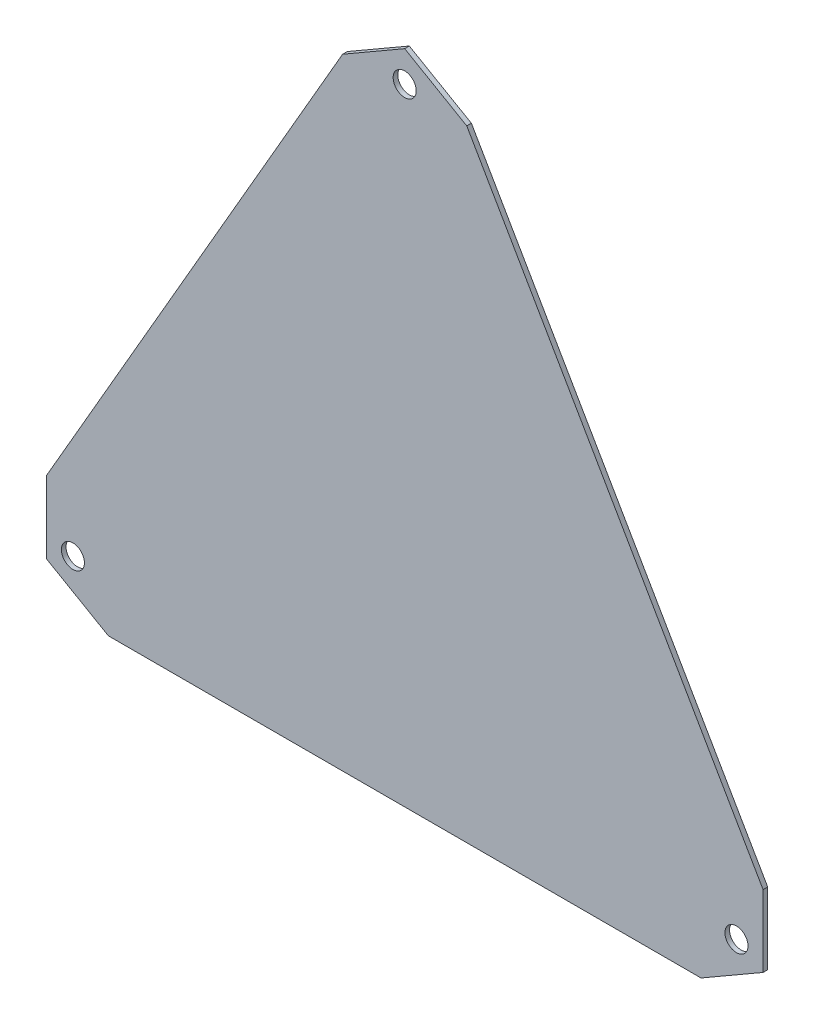
ISO-10303-21;
HEADER;
FILE_DESCRIPTION(('STEP AP214'),'2;1');
FILE_NAME('part.step','',(''),(''),'','','');
FILE_SCHEMA(('AUTOMOTIVE_DESIGN { 1 0 10303 214 1 1 1 1 }'));
ENDSEC;
DATA;
#1=APPLICATION_CONTEXT('core data for automotive mechanical design processes');
#2=APPLICATION_PROTOCOL_DEFINITION('international standard','automotive_design',2000,#1);
#3=PRODUCT_CONTEXT('',#1,'mechanical');
#4=PRODUCT('Part','Part','',(#3));
#5=PRODUCT_RELATED_PRODUCT_CATEGORY('part','',(#4));
#6=PRODUCT_DEFINITION_FORMATION('','',#4);
#7=PRODUCT_DEFINITION_CONTEXT('part definition',#1,'design');
#8=PRODUCT_DEFINITION('design','',#6,#7);
#9=PRODUCT_DEFINITION_SHAPE('','',#8);
#10=(LENGTH_UNIT() NAMED_UNIT(*) SI_UNIT(.MILLI.,.METRE.));
#11=(NAMED_UNIT(*) PLANE_ANGLE_UNIT() SI_UNIT($,.RADIAN.));
#12=(NAMED_UNIT(*) SI_UNIT($,.STERADIAN.) SOLID_ANGLE_UNIT());
#13=UNCERTAINTY_MEASURE_WITH_UNIT(LENGTH_MEASURE(1.E-05),#10,'distance_accuracy_value','');
#14=(GEOMETRIC_REPRESENTATION_CONTEXT(3) GLOBAL_UNCERTAINTY_ASSIGNED_CONTEXT((#13)) GLOBAL_UNIT_ASSIGNED_CONTEXT((#10,
#11,#12)) REPRESENTATION_CONTEXT('',''));
#15=CARTESIAN_POINT('',(0.,0.,0.));
#16=DIRECTION('',(0.,0.,1.));
#17=DIRECTION('',(1.,0.,0.));
#18=AXIS2_PLACEMENT_3D('',#15,#16,#17);
#19=CARTESIAN_POINT('',(0.,0.,1.2));
#20=DIRECTION('',(0.,0.,-1.));
#21=DIRECTION('',(-1.,0.,0.));
#22=AXIS2_PLACEMENT_3D('',#19,#20,#21);
#23=PLANE('',#22);
#24=CARTESIAN_POINT('',(0.,99.5814584479949,1.2));
#25=DIRECTION('',(0.,0.,1.));
#26=DIRECTION('',(1.,0.,0.));
#27=AXIS2_PLACEMENT_3D('',#24,#25,#26);
#28=CIRCLE('',#27,3.);
#29=CARTESIAN_POINT('',(3.,99.5814584479949,1.2));
#30=VERTEX_POINT('',#29);
#31=EDGE_CURVE('E198',#30,#30,#28,.T.);
#32=ORIENTED_EDGE('',*,*,#31,.F.);
#33=EDGE_LOOP('',(#32));
#34=FACE_BOUND('',#33,.T.);
#35=DIRECTION('',(0.866025403784433,0.50000000000001,0.));
#36=VECTOR('',#35,1.);
#37=CARTESIAN_POINT('',(77.0325273042285,-63.1067080725419,1.2));
#38=LINE('',#37,#36);
#39=CARTESIAN_POINT('',(77.0325273042285,-63.1067080725419,1.2));
#40=VERTEX_POINT('',#39);
#41=CARTESIAN_POINT('',(93.1682759921434,-53.7907292239979,1.2));
#42=VERTEX_POINT('',#41);
#43=EDGE_CURVE('E153',#40,#42,#38,.T.);
#44=ORIENTED_EDGE('',*,*,#43,.T.);
#45=DIRECTION('',(0.,1.,0.));
#46=VECTOR('',#45,1.);
#47=CARTESIAN_POINT('',(93.1682759921437,-35.1587715269102,1.2));
#48=LINE('',#47,#46);
#49=CARTESIAN_POINT('',(93.1682759921437,-35.1587715269102,1.2));
#50=VERTEX_POINT('',#49);
#51=EDGE_CURVE('E96',#42,#50,#48,.T.);
#52=ORIENTED_EDGE('',*,*,#51,.T.);
#53=DIRECTION('',(-0.499999999999998,0.86602540378444,0.));
#54=VECTOR('',#53,1.);
#55=CARTESIAN_POINT('',(16.1357486879151,98.2654795994513,1.2));
#56=LINE('',#55,#54);
#57=CARTESIAN_POINT('',(16.1357486879151,98.2654795994513,1.2));
#58=VERTEX_POINT('',#57);
#59=EDGE_CURVE('E171',#50,#58,#56,.T.);
#60=ORIENTED_EDGE('',*,*,#59,.T.);
#61=DIRECTION('',(-0.866025403784437,0.500000000000002,0.));
#62=VECTOR('',#61,1.);
#63=CARTESIAN_POINT('',(16.1357486879151,98.2654795994513,1.2));
#64=LINE('',#63,#62);
#65=CARTESIAN_POINT('',(7.07767178198537E-13,107.581458447995,1.2));
#66=VERTEX_POINT('',#65);
#67=EDGE_CURVE('E188',#58,#66,#64,.T.);
#68=ORIENTED_EDGE('',*,*,#67,.T.);
#69=DIRECTION('',(-0.866025403784442,-0.499999999999994,0.));
#70=VECTOR('',#69,1.);
#71=CARTESIAN_POINT('',(-16.1357486879137,98.2654795994515,1.2));
#72=LINE('',#71,#70);
#73=CARTESIAN_POINT('',(-16.1357486879137,98.2654795994515,1.2));
#74=VERTEX_POINT('',#73);
#75=EDGE_CURVE('E187',#66,#74,#72,.T.);
#76=ORIENTED_EDGE('',*,*,#75,.T.);
#77=DIRECTION('',(-0.50000000000001,-0.866025403784433,0.));
#78=VECTOR('',#77,1.);
#79=CARTESIAN_POINT('',(-93.1682759921442,-35.1587715269089,1.2));
#80=LINE('',#79,#78);
#81=CARTESIAN_POINT('',(-93.1682759921442,-35.1587715269089,1.2));
#82=VERTEX_POINT('',#81);
#83=EDGE_CURVE('E118',#74,#82,#80,.T.);
#84=ORIENTED_EDGE('',*,*,#83,.T.);
#85=DIRECTION('',(0.,-1.,0.));
#86=VECTOR('',#85,1.);
#87=CARTESIAN_POINT('',(-93.1682759921442,-35.1587715269089,1.2));
#88=LINE('',#87,#86);
#89=CARTESIAN_POINT('',(-93.1682759921438,-53.7907292239973,1.2));
#90=VERTEX_POINT('',#89);
#91=EDGE_CURVE('E112',#82,#90,#88,.T.);
#92=ORIENTED_EDGE('',*,*,#91,.T.);
#93=DIRECTION('',(0.866025403784437,-0.500000000000002,0.));
#94=VECTOR('',#93,1.);
#95=CARTESIAN_POINT('',(-77.0325273042294,-63.1067080725408,1.2));
#96=LINE('',#95,#94);
#97=CARTESIAN_POINT('',(-77.0325273042294,-63.1067080725408,1.2));
#98=VERTEX_POINT('',#97);
#99=EDGE_CURVE('E116',#90,#98,#96,.T.);
#100=ORIENTED_EDGE('',*,*,#99,.T.);
#101=DIRECTION('',(1.,0.,0.));
#102=VECTOR('',#101,1.);
#103=CARTESIAN_POINT('',(77.0325273042285,-63.1067080725419,1.2));
#104=LINE('',#103,#102);
#105=EDGE_CURVE('E50',#98,#40,#104,.T.);
#106=ORIENTED_EDGE('',*,*,#105,.T.);
#107=EDGE_LOOP('',(#44,#52,#60,#68,#76,#84,#92,#100,#106));
#108=FACE_BOUND('',#107,.T.);
#109=CARTESIAN_POINT('',(-86.2400727618683,-49.7907292239972,1.2));
#110=DIRECTION('',(0.,0.,1.));
#111=DIRECTION('',(1.,0.,0.));
#112=AXIS2_PLACEMENT_3D('',#109,#110,#111);
#113=CIRCLE('',#112,3.00000000000001);
#114=CARTESIAN_POINT('',(-83.2400727618683,-49.7907292239972,1.2));
#115=VERTEX_POINT('',#114);
#116=EDGE_CURVE('E140',#115,#115,#113,.T.);
#117=ORIENTED_EDGE('',*,*,#116,.F.);
#118=EDGE_LOOP('',(#117));
#119=FACE_BOUND('',#118,.T.);
#120=CARTESIAN_POINT('',(86.2400727618683,-49.7907292239972,1.2));
#121=DIRECTION('',(0.,0.,1.));
#122=DIRECTION('',(1.,0.,0.));
#123=AXIS2_PLACEMENT_3D('',#120,#121,#122);
#124=CIRCLE('',#123,3.00000000000001);
#125=CARTESIAN_POINT('',(89.2400727618683,-49.7907292239972,1.2));
#126=VERTEX_POINT('',#125);
#127=EDGE_CURVE('E204',#126,#126,#124,.T.);
#128=ORIENTED_EDGE('',*,*,#127,.F.);
#129=EDGE_LOOP('',(#128));
#130=FACE_BOUND('',#129,.T.);
#131=ADVANCED_FACE('F33',(#34,#108,#119,#130),#23,.F.);
#132=CARTESIAN_POINT('',(0.,0.,0.));
#133=DIRECTION('',(0.,0.,-1.));
#134=DIRECTION('',(-1.,0.,0.));
#135=AXIS2_PLACEMENT_3D('',#132,#133,#134);
#136=PLANE('',#135);
#137=CARTESIAN_POINT('',(0.,99.5814584479949,0.));
#138=DIRECTION('',(0.,0.,1.));
#139=DIRECTION('',(1.,0.,0.));
#140=AXIS2_PLACEMENT_3D('',#137,#138,#139);
#141=CIRCLE('',#140,3.);
#142=CARTESIAN_POINT('',(3.,99.5814584479949,0.));
#143=VERTEX_POINT('',#142);
#144=EDGE_CURVE('E201',#143,#143,#141,.T.);
#145=ORIENTED_EDGE('',*,*,#144,.T.);
#146=EDGE_LOOP('',(#145));
#147=FACE_BOUND('',#146,.T.);
#148=DIRECTION('',(0.866025403784433,0.50000000000001,0.));
#149=VECTOR('',#148,1.);
#150=CARTESIAN_POINT('',(77.0325273042285,-63.1067080725419,0.));
#151=LINE('',#150,#149);
#152=CARTESIAN_POINT('',(77.0325273042285,-63.1067080725419,0.));
#153=VERTEX_POINT('',#152);
#154=CARTESIAN_POINT('',(93.1682759921434,-53.7907292239979,0.));
#155=VERTEX_POINT('',#154);
#156=EDGE_CURVE('E136',#153,#155,#151,.T.);
#157=ORIENTED_EDGE('',*,*,#156,.F.);
#158=DIRECTION('',(1.,0.,0.));
#159=VECTOR('',#158,1.);
#160=CARTESIAN_POINT('',(77.0325273042285,-63.1067080725419,0.));
#161=LINE('',#160,#159);
#162=CARTESIAN_POINT('',(-77.0325273042294,-63.1067080725408,0.));
#163=VERTEX_POINT('',#162);
#164=EDGE_CURVE('E88',#163,#153,#161,.T.);
#165=ORIENTED_EDGE('',*,*,#164,.F.);
#166=DIRECTION('',(0.866025403784437,-0.500000000000002,0.));
#167=VECTOR('',#166,1.);
#168=CARTESIAN_POINT('',(-77.0325273042294,-63.1067080725408,0.));
#169=LINE('',#168,#167);
#170=CARTESIAN_POINT('',(-93.1682759921438,-53.7907292239973,0.));
#171=VERTEX_POINT('',#170);
#172=EDGE_CURVE('E82',#171,#163,#169,.T.);
#173=ORIENTED_EDGE('',*,*,#172,.F.);
#174=DIRECTION('',(0.,-1.,0.));
#175=VECTOR('',#174,1.);
#176=CARTESIAN_POINT('',(-93.1682759921442,-35.1587715269089,0.));
#177=LINE('',#176,#175);
#178=CARTESIAN_POINT('',(-93.1682759921442,-35.1587715269089,0.));
#179=VERTEX_POINT('',#178);
#180=EDGE_CURVE('E126',#179,#171,#177,.T.);
#181=ORIENTED_EDGE('',*,*,#180,.F.);
#182=DIRECTION('',(-0.50000000000001,-0.866025403784433,0.));
#183=VECTOR('',#182,1.);
#184=CARTESIAN_POINT('',(-93.1682759921442,-35.1587715269089,0.));
#185=LINE('',#184,#183);
#186=CARTESIAN_POINT('',(-16.1357486879137,98.2654795994515,0.));
#187=VERTEX_POINT('',#186);
#188=EDGE_CURVE('E148',#187,#179,#185,.T.);
#189=ORIENTED_EDGE('',*,*,#188,.F.);
#190=DIRECTION('',(-0.866025403784442,-0.499999999999994,0.));
#191=VECTOR('',#190,1.);
#192=CARTESIAN_POINT('',(-16.1357486879137,98.2654795994515,0.));
#193=LINE('',#192,#191);
#194=CARTESIAN_POINT('',(7.07767178198537E-13,107.581458447995,0.));
#195=VERTEX_POINT('',#194);
#196=EDGE_CURVE('E146',#195,#187,#193,.T.);
#197=ORIENTED_EDGE('',*,*,#196,.F.);
#198=DIRECTION('',(-0.866025403784437,0.500000000000002,0.));
#199=VECTOR('',#198,1.);
#200=CARTESIAN_POINT('',(16.1357486879151,98.2654795994513,0.));
#201=LINE('',#200,#199);
#202=CARTESIAN_POINT('',(16.1357486879151,98.2654795994513,0.));
#203=VERTEX_POINT('',#202);
#204=EDGE_CURVE('E144',#203,#195,#201,.T.);
#205=ORIENTED_EDGE('',*,*,#204,.F.);
#206=DIRECTION('',(-0.499999999999998,0.86602540378444,0.));
#207=VECTOR('',#206,1.);
#208=CARTESIAN_POINT('',(16.1357486879151,98.2654795994513,0.));
#209=LINE('',#208,#207);
#210=CARTESIAN_POINT('',(93.1682759921437,-35.1587715269102,0.));
#211=VERTEX_POINT('',#210);
#212=EDGE_CURVE('E142',#211,#203,#209,.T.);
#213=ORIENTED_EDGE('',*,*,#212,.F.);
#214=DIRECTION('',(0.,1.,0.));
#215=VECTOR('',#214,1.);
#216=CARTESIAN_POINT('',(93.1682759921437,-35.1587715269102,0.));
#217=LINE('',#216,#215);
#218=EDGE_CURVE('E139',#155,#211,#217,.T.);
#219=ORIENTED_EDGE('',*,*,#218,.F.);
#220=EDGE_LOOP('',(#157,#165,#173,#181,#189,#197,#205,#213,#219));
#221=FACE_BOUND('',#220,.T.);
#222=CARTESIAN_POINT('',(-86.2400727618683,-49.7907292239972,0.));
#223=DIRECTION('',(0.,0.,1.));
#224=DIRECTION('',(1.,0.,0.));
#225=AXIS2_PLACEMENT_3D('',#222,#223,#224);
#226=CIRCLE('',#225,3.00000000000001);
#227=CARTESIAN_POINT('',(-83.2400727618683,-49.7907292239972,0.));
#228=VERTEX_POINT('',#227);
#229=EDGE_CURVE('E195',#228,#228,#226,.T.);
#230=ORIENTED_EDGE('',*,*,#229,.T.);
#231=EDGE_LOOP('',(#230));
#232=FACE_BOUND('',#231,.T.);
#233=CARTESIAN_POINT('',(86.2400727618683,-49.7907292239972,0.));
#234=DIRECTION('',(0.,0.,1.));
#235=DIRECTION('',(1.,0.,0.));
#236=AXIS2_PLACEMENT_3D('',#233,#234,#235);
#237=CIRCLE('',#236,3.00000000000001);
#238=CARTESIAN_POINT('',(89.2400727618683,-49.7907292239972,0.));
#239=VERTEX_POINT('',#238);
#240=EDGE_CURVE('E207',#239,#239,#237,.T.);
#241=ORIENTED_EDGE('',*,*,#240,.T.);
#242=EDGE_LOOP('',(#241));
#243=FACE_BOUND('',#242,.T.);
#244=ADVANCED_FACE('F175',(#147,#221,#232,#243),#136,.T.);
#245=CARTESIAN_POINT('',(77.0325273042285,-63.1067080725419,1.2));
#246=DIRECTION('',(-0.50000000000001,0.866025403784433,0.));
#247=DIRECTION('',(-0.866025403784433,-0.50000000000001,0.));
#248=AXIS2_PLACEMENT_3D('',#245,#246,#247);
#249=PLANE('',#248);
#250=ORIENTED_EDGE('',*,*,#156,.T.);
#251=DIRECTION('',(0.,0.,-1.));
#252=VECTOR('',#251,1.);
#253=CARTESIAN_POINT('',(93.1682759921434,-53.7907292239979,1.2));
#254=LINE('',#253,#252);
#255=EDGE_CURVE('E11',#42,#155,#254,.T.);
#256=ORIENTED_EDGE('',*,*,#255,.F.);
#257=ORIENTED_EDGE('',*,*,#43,.F.);
#258=DIRECTION('',(0.,0.,-1.));
#259=VECTOR('',#258,1.);
#260=CARTESIAN_POINT('',(77.0325273042285,-63.1067080725419,1.2));
#261=LINE('',#260,#259);
#262=EDGE_CURVE('E132',#40,#153,#261,.T.);
#263=ORIENTED_EDGE('',*,*,#262,.T.);
#264=EDGE_LOOP('',(#250,#256,#257,#263));
#265=FACE_BOUND('',#264,.T.);
#266=ADVANCED_FACE('F35',(#265),#249,.F.);
#267=CARTESIAN_POINT('',(93.1682759921437,-35.1587715269102,1.2));
#268=DIRECTION('',(-1.,0.,0.));
#269=DIRECTION('',(0.,-1.,0.));
#270=AXIS2_PLACEMENT_3D('',#267,#268,#269);
#271=PLANE('',#270);
#272=ORIENTED_EDGE('',*,*,#218,.T.);
#273=DIRECTION('',(0.,0.,-1.));
#274=VECTOR('',#273,1.);
#275=CARTESIAN_POINT('',(93.1682759921437,-35.1587715269102,1.2));
#276=LINE('',#275,#274);
#277=EDGE_CURVE('E42',#50,#211,#276,.T.);
#278=ORIENTED_EDGE('',*,*,#277,.F.);
#279=ORIENTED_EDGE('',*,*,#51,.F.);
#280=ORIENTED_EDGE('',*,*,#255,.T.);
#281=EDGE_LOOP('',(#272,#278,#279,#280));
#282=FACE_BOUND('',#281,.T.);
#283=ADVANCED_FACE('F245',(#282),#271,.F.);
#284=CARTESIAN_POINT('',(16.1357486879151,98.2654795994513,1.2));
#285=DIRECTION('',(-0.86602540378444,-0.499999999999998,0.));
#286=DIRECTION('',(0.499999999999998,-0.86602540378444,0.));
#287=AXIS2_PLACEMENT_3D('',#284,#285,#286);
#288=PLANE('',#287);
#289=ORIENTED_EDGE('',*,*,#212,.T.);
#290=DIRECTION('',(0.,0.,-1.));
#291=VECTOR('',#290,1.);
#292=CARTESIAN_POINT('',(16.1357486879151,98.2654795994513,1.2));
#293=LINE('',#292,#291);
#294=EDGE_CURVE('E163',#58,#203,#293,.T.);
#295=ORIENTED_EDGE('',*,*,#294,.F.);
#296=ORIENTED_EDGE('',*,*,#59,.F.);
#297=ORIENTED_EDGE('',*,*,#277,.T.);
#298=EDGE_LOOP('',(#289,#295,#296,#297));
#299=FACE_BOUND('',#298,.T.);
#300=ADVANCED_FACE('F169',(#299),#288,.F.);
#301=CARTESIAN_POINT('',(16.1357486879151,98.2654795994513,1.2));
#302=DIRECTION('',(-0.500000000000002,-0.866025403784437,0.));
#303=DIRECTION('',(0.866025403784437,-0.500000000000002,0.));
#304=AXIS2_PLACEMENT_3D('',#301,#302,#303);
#305=PLANE('',#304);
#306=ORIENTED_EDGE('',*,*,#204,.T.);
#307=DIRECTION('',(0.,0.,-1.));
#308=VECTOR('',#307,1.);
#309=CARTESIAN_POINT('',(7.07767178198537E-13,107.581458447995,1.2));
#310=LINE('',#309,#308);
#311=EDGE_CURVE('E160',#66,#195,#310,.T.);
#312=ORIENTED_EDGE('',*,*,#311,.F.);
#313=ORIENTED_EDGE('',*,*,#67,.F.);
#314=ORIENTED_EDGE('',*,*,#294,.T.);
#315=EDGE_LOOP('',(#306,#312,#313,#314));
#316=FACE_BOUND('',#315,.T.);
#317=ADVANCED_FACE('F181',(#316),#305,.F.);
#318=CARTESIAN_POINT('',(-16.1357486879137,98.2654795994515,1.2));
#319=DIRECTION('',(0.499999999999994,-0.866025403784442,0.));
#320=DIRECTION('',(0.866025403784442,0.499999999999994,0.));
#321=AXIS2_PLACEMENT_3D('',#318,#319,#320);
#322=PLANE('',#321);
#323=ORIENTED_EDGE('',*,*,#196,.T.);
#324=DIRECTION('',(0.,0.,-1.));
#325=VECTOR('',#324,1.);
#326=CARTESIAN_POINT('',(-16.1357486879137,98.2654795994515,1.2));
#327=LINE('',#326,#325);
#328=EDGE_CURVE('E157',#74,#187,#327,.T.);
#329=ORIENTED_EDGE('',*,*,#328,.F.);
#330=ORIENTED_EDGE('',*,*,#75,.F.);
#331=ORIENTED_EDGE('',*,*,#311,.T.);
#332=EDGE_LOOP('',(#323,#329,#330,#331));
#333=FACE_BOUND('',#332,.T.);
#334=ADVANCED_FACE('F185',(#333),#322,.F.);
#335=CARTESIAN_POINT('',(-93.1682759921442,-35.1587715269089,1.2));
#336=DIRECTION('',(0.866025403784433,-0.50000000000001,0.));
#337=DIRECTION('',(0.50000000000001,0.866025403784433,0.));
#338=AXIS2_PLACEMENT_3D('',#335,#336,#337);
#339=PLANE('',#338);
#340=ORIENTED_EDGE('',*,*,#188,.T.);
#341=DIRECTION('',(0.,0.,-1.));
#342=VECTOR('',#341,1.);
#343=CARTESIAN_POINT('',(-93.1682759921442,-35.1587715269089,1.2));
#344=LINE('',#343,#342);
#345=EDGE_CURVE('E127',#82,#179,#344,.T.);
#346=ORIENTED_EDGE('',*,*,#345,.F.);
#347=ORIENTED_EDGE('',*,*,#83,.F.);
#348=ORIENTED_EDGE('',*,*,#328,.T.);
#349=EDGE_LOOP('',(#340,#346,#347,#348));
#350=FACE_BOUND('',#349,.T.);
#351=ADVANCED_FACE('F236',(#350),#339,.F.);
#352=CARTESIAN_POINT('',(-93.1682759921442,-35.1587715269089,1.2));
#353=DIRECTION('',(1.,0.,0.));
#354=DIRECTION('',(0.,1.,0.));
#355=AXIS2_PLACEMENT_3D('',#352,#353,#354);
#356=PLANE('',#355);
#357=ORIENTED_EDGE('',*,*,#180,.T.);
#358=DIRECTION('',(0.,0.,-1.));
#359=VECTOR('',#358,1.);
#360=CARTESIAN_POINT('',(-93.1682759921438,-53.7907292239973,1.2));
#361=LINE('',#360,#359);
#362=EDGE_CURVE('E123',#90,#171,#361,.T.);
#363=ORIENTED_EDGE('',*,*,#362,.F.);
#364=ORIENTED_EDGE('',*,*,#91,.F.);
#365=ORIENTED_EDGE('',*,*,#345,.T.);
#366=EDGE_LOOP('',(#357,#363,#364,#365));
#367=FACE_BOUND('',#366,.T.);
#368=ADVANCED_FACE('F124',(#367),#356,.F.);
#369=CARTESIAN_POINT('',(-77.0325273042294,-63.1067080725408,1.2));
#370=DIRECTION('',(0.500000000000002,0.866025403784437,0.));
#371=DIRECTION('',(-0.866025403784437,0.500000000000002,0.));
#372=AXIS2_PLACEMENT_3D('',#369,#370,#371);
#373=PLANE('',#372);
#374=ORIENTED_EDGE('',*,*,#172,.T.);
#375=DIRECTION('',(0.,0.,-1.));
#376=VECTOR('',#375,1.);
#377=CARTESIAN_POINT('',(-77.0325273042294,-63.1067080725408,1.2));
#378=LINE('',#377,#376);
#379=EDGE_CURVE('E128',#98,#163,#378,.T.);
#380=ORIENTED_EDGE('',*,*,#379,.F.);
#381=ORIENTED_EDGE('',*,*,#99,.F.);
#382=ORIENTED_EDGE('',*,*,#362,.T.);
#383=EDGE_LOOP('',(#374,#380,#381,#382));
#384=FACE_BOUND('',#383,.T.);
#385=ADVANCED_FACE('F130',(#384),#373,.F.);
#386=CARTESIAN_POINT('',(77.0325273042285,-63.1067080725419,1.2));
#387=DIRECTION('',(0.,1.,0.));
#388=DIRECTION('',(-1.,0.,0.));
#389=AXIS2_PLACEMENT_3D('',#386,#387,#388);
#390=PLANE('',#389);
#391=ORIENTED_EDGE('',*,*,#164,.T.);
#392=ORIENTED_EDGE('',*,*,#262,.F.);
#393=ORIENTED_EDGE('',*,*,#105,.F.);
#394=ORIENTED_EDGE('',*,*,#379,.T.);
#395=EDGE_LOOP('',(#391,#392,#393,#394));
#396=FACE_BOUND('',#395,.T.);
#397=ADVANCED_FACE('F229',(#396),#390,.F.);
#398=CARTESIAN_POINT('',(-86.2400727618683,-49.7907292239972,1.2));
#399=DIRECTION('',(0.,0.,-1.));
#400=DIRECTION('',(-1.,0.,0.));
#401=AXIS2_PLACEMENT_3D('',#398,#399,#400);
#402=CYLINDRICAL_SURFACE('',#401,3.00000000000001);
#403=ORIENTED_EDGE('',*,*,#116,.T.);
#404=EDGE_LOOP('',(#403));
#405=FACE_BOUND('',#404,.T.);
#406=ORIENTED_EDGE('',*,*,#229,.F.);
#407=EDGE_LOOP('',(#406));
#408=FACE_BOUND('',#407,.T.);
#409=ADVANCED_FACE('F226',(#405,#408),#402,.F.);
#410=CARTESIAN_POINT('',(0.,99.5814584479949,1.2));
#411=DIRECTION('',(0.,0.,-1.));
#412=DIRECTION('',(-1.,0.,0.));
#413=AXIS2_PLACEMENT_3D('',#410,#411,#412);
#414=CYLINDRICAL_SURFACE('',#413,3.);
#415=ORIENTED_EDGE('',*,*,#31,.T.);
#416=EDGE_LOOP('',(#415));
#417=FACE_BOUND('',#416,.T.);
#418=ORIENTED_EDGE('',*,*,#144,.F.);
#419=EDGE_LOOP('',(#418));
#420=FACE_BOUND('',#419,.T.);
#421=ADVANCED_FACE('F314',(#417,#420),#414,.F.);
#422=CARTESIAN_POINT('',(86.2400727618683,-49.7907292239972,1.2));
#423=DIRECTION('',(0.,0.,-1.));
#424=DIRECTION('',(-1.,0.,0.));
#425=AXIS2_PLACEMENT_3D('',#422,#423,#424);
#426=CYLINDRICAL_SURFACE('',#425,3.00000000000001);
#427=ORIENTED_EDGE('',*,*,#127,.T.);
#428=EDGE_LOOP('',(#427));
#429=FACE_BOUND('',#428,.T.);
#430=ORIENTED_EDGE('',*,*,#240,.F.);
#431=EDGE_LOOP('',(#430));
#432=FACE_BOUND('',#431,.T.);
#433=ADVANCED_FACE('F213',(#429,#432),#426,.F.);
#434=CLOSED_SHELL('',(#131,#244,#266,#283,#300,#317,#334,#351,#368,#385,#397,#409,#421,#433));
#435=MANIFOLD_SOLID_BREP('B2',#434);
#436=ADVANCED_BREP_SHAPE_REPRESENTATION('',(#18,#435),#14);
#437=SHAPE_DEFINITION_REPRESENTATION(#9,#436);
ENDSEC;
END-ISO-10303-21;
